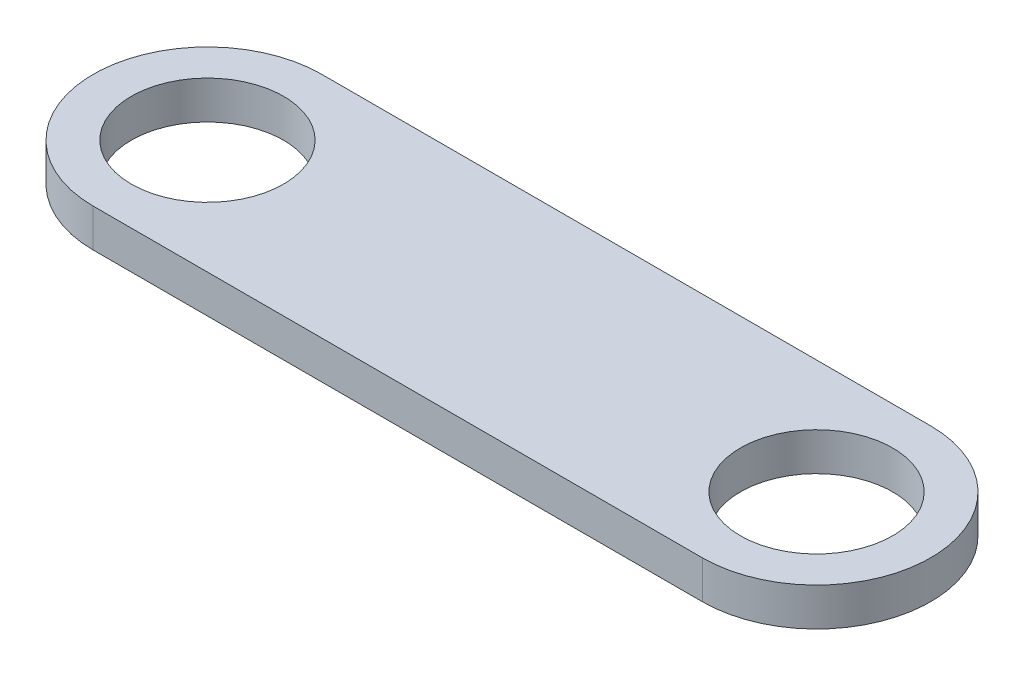
ISO-10303-21;
HEADER;
FILE_DESCRIPTION(('STEP AP214'),'2;1');
FILE_NAME('part.step','',(''),(''),'','','');
FILE_SCHEMA(('AUTOMOTIVE_DESIGN { 1 0 10303 214 1 1 1 1 }'));
ENDSEC;
DATA;
#1=APPLICATION_CONTEXT('core data for automotive mechanical design processes');
#2=APPLICATION_PROTOCOL_DEFINITION('international standard','automotive_design',2000,#1);
#3=PRODUCT_CONTEXT('',#1,'mechanical');
#4=PRODUCT('Part','Part','',(#3));
#5=PRODUCT_RELATED_PRODUCT_CATEGORY('part','',(#4));
#6=PRODUCT_DEFINITION_FORMATION('','',#4);
#7=PRODUCT_DEFINITION_CONTEXT('part definition',#1,'design');
#8=PRODUCT_DEFINITION('design','',#6,#7);
#9=PRODUCT_DEFINITION_SHAPE('','',#8);
#10=(LENGTH_UNIT() NAMED_UNIT(*) SI_UNIT(.MILLI.,.METRE.));
#11=(NAMED_UNIT(*) PLANE_ANGLE_UNIT() SI_UNIT($,.RADIAN.));
#12=(NAMED_UNIT(*) SI_UNIT($,.STERADIAN.) SOLID_ANGLE_UNIT());
#13=UNCERTAINTY_MEASURE_WITH_UNIT(LENGTH_MEASURE(1.E-05),#10,'distance_accuracy_value','');
#14=(GEOMETRIC_REPRESENTATION_CONTEXT(3) GLOBAL_UNCERTAINTY_ASSIGNED_CONTEXT((#13)) GLOBAL_UNIT_ASSIGNED_CONTEXT((#10,
#11,#12)) REPRESENTATION_CONTEXT('',''));
#15=CARTESIAN_POINT('',(0.,0.,0.));
#16=DIRECTION('',(0.,0.,1.));
#17=DIRECTION('',(1.,0.,0.));
#18=AXIS2_PLACEMENT_3D('',#15,#16,#17);
#19=CARTESIAN_POINT('',(0.,3.175,0.));
#20=DIRECTION('',(0.,1.,0.));
#21=DIRECTION('',(0.,0.,1.));
#22=AXIS2_PLACEMENT_3D('',#19,#20,#21);
#23=PLANE('',#22);
#24=CARTESIAN_POINT('',(0.,3.175,0.));
#25=DIRECTION('',(0.,1.,0.));
#26=DIRECTION('',(0.,0.,1.));
#27=AXIS2_PLACEMENT_3D('',#24,#25,#26);
#28=CIRCLE('',#27,6.35);
#29=CARTESIAN_POINT('',(0.,3.175,6.35));
#30=VERTEX_POINT('',#29);
#31=EDGE_CURVE('E100',#30,#30,#28,.T.);
#32=ORIENTED_EDGE('',*,*,#31,.F.);
#33=EDGE_LOOP('',(#32));
#34=FACE_BOUND('',#33,.T.);
#35=CARTESIAN_POINT('',(0.,3.175,0.));
#36=DIRECTION('',(0.,1.,0.));
#37=DIRECTION('',(0.,0.,1.));
#38=AXIS2_PLACEMENT_3D('',#35,#36,#37);
#39=CIRCLE('',#38,9.525);
#40=CARTESIAN_POINT('',(0.,3.175,-9.525));
#41=VERTEX_POINT('',#40);
#42=CARTESIAN_POINT('',(0.,3.175,9.525));
#43=VERTEX_POINT('',#42);
#44=EDGE_CURVE('E85',#41,#43,#39,.T.);
#45=ORIENTED_EDGE('',*,*,#44,.T.);
#46=DIRECTION('',(1.,0.,0.));
#47=VECTOR('',#46,1.);
#48=CARTESIAN_POINT('',(0.,3.175,9.525));
#49=LINE('',#48,#47);
#50=CARTESIAN_POINT('',(50.8,3.175,9.525));
#51=VERTEX_POINT('',#50);
#52=EDGE_CURVE('E80',#43,#51,#49,.T.);
#53=ORIENTED_EDGE('',*,*,#52,.T.);
#54=CARTESIAN_POINT('',(50.8,3.175,0.));
#55=DIRECTION('',(0.,1.,0.));
#56=DIRECTION('',(0.,0.,1.));
#57=AXIS2_PLACEMENT_3D('',#54,#55,#56);
#58=CIRCLE('',#57,9.525);
#59=CARTESIAN_POINT('',(50.8,3.175,-9.525));
#60=VERTEX_POINT('',#59);
#61=EDGE_CURVE('E83',#51,#60,#58,.T.);
#62=ORIENTED_EDGE('',*,*,#61,.T.);
#63=DIRECTION('',(-1.,0.,0.));
#64=VECTOR('',#63,1.);
#65=CARTESIAN_POINT('',(0.,3.175,-9.525));
#66=LINE('',#65,#64);
#67=EDGE_CURVE('E50',#60,#41,#66,.T.);
#68=ORIENTED_EDGE('',*,*,#67,.T.);
#69=EDGE_LOOP('',(#45,#53,#62,#68));
#70=FACE_BOUND('',#69,.T.);
#71=CARTESIAN_POINT('',(50.8,3.175,0.));
#72=DIRECTION('',(0.,1.,0.));
#73=DIRECTION('',(0.,0.,1.));
#74=AXIS2_PLACEMENT_3D('',#71,#72,#73);
#75=CIRCLE('',#74,6.35);
#76=CARTESIAN_POINT('',(50.8,3.175,6.35));
#77=VERTEX_POINT('',#76);
#78=EDGE_CURVE('E115',#77,#77,#75,.T.);
#79=ORIENTED_EDGE('',*,*,#78,.F.);
#80=EDGE_LOOP('',(#79));
#81=FACE_BOUND('',#80,.T.);
#82=ADVANCED_FACE('F33',(#34,#70,#81),#23,.T.);
#83=CARTESIAN_POINT('',(0.,0.,0.));
#84=DIRECTION('',(0.,1.,0.));
#85=DIRECTION('',(0.,0.,1.));
#86=AXIS2_PLACEMENT_3D('',#83,#84,#85);
#87=PLANE('',#86);
#88=CARTESIAN_POINT('',(0.,0.,0.));
#89=DIRECTION('',(0.,1.,0.));
#90=DIRECTION('',(0.,0.,1.));
#91=AXIS2_PLACEMENT_3D('',#88,#89,#90);
#92=CIRCLE('',#91,9.525);
#93=CARTESIAN_POINT('',(0.,0.,-9.525));
#94=VERTEX_POINT('',#93);
#95=CARTESIAN_POINT('',(0.,0.,9.525));
#96=VERTEX_POINT('',#95);
#97=EDGE_CURVE('E97',#94,#96,#92,.T.);
#98=ORIENTED_EDGE('',*,*,#97,.F.);
#99=DIRECTION('',(-1.,0.,0.));
#100=VECTOR('',#99,1.);
#101=CARTESIAN_POINT('',(0.,0.,-9.525));
#102=LINE('',#101,#100);
#103=CARTESIAN_POINT('',(50.8,0.,-9.525));
#104=VERTEX_POINT('',#103);
#105=EDGE_CURVE('E73',#104,#94,#102,.T.);
#106=ORIENTED_EDGE('',*,*,#105,.F.);
#107=CARTESIAN_POINT('',(50.8,0.,0.));
#108=DIRECTION('',(0.,1.,0.));
#109=DIRECTION('',(0.,0.,1.));
#110=AXIS2_PLACEMENT_3D('',#107,#108,#109);
#111=CIRCLE('',#110,9.525);
#112=CARTESIAN_POINT('',(50.8,0.,9.525));
#113=VERTEX_POINT('',#112);
#114=EDGE_CURVE('E67',#113,#104,#111,.T.);
#115=ORIENTED_EDGE('',*,*,#114,.F.);
#116=DIRECTION('',(1.,0.,0.));
#117=VECTOR('',#116,1.);
#118=CARTESIAN_POINT('',(0.,0.,9.525));
#119=LINE('',#118,#117);
#120=EDGE_CURVE('E89',#96,#113,#119,.T.);
#121=ORIENTED_EDGE('',*,*,#120,.F.);
#122=EDGE_LOOP('',(#98,#106,#115,#121));
#123=FACE_BOUND('',#122,.T.);
#124=CARTESIAN_POINT('',(0.,0.,0.));
#125=DIRECTION('',(0.,1.,0.));
#126=DIRECTION('',(0.,0.,1.));
#127=AXIS2_PLACEMENT_3D('',#124,#125,#126);
#128=CIRCLE('',#127,6.35);
#129=CARTESIAN_POINT('',(0.,0.,6.35));
#130=VERTEX_POINT('',#129);
#131=EDGE_CURVE('E112',#130,#130,#128,.T.);
#132=ORIENTED_EDGE('',*,*,#131,.T.);
#133=EDGE_LOOP('',(#132));
#134=FACE_BOUND('',#133,.T.);
#135=CARTESIAN_POINT('',(50.8,0.,0.));
#136=DIRECTION('',(0.,1.,0.));
#137=DIRECTION('',(0.,0.,1.));
#138=AXIS2_PLACEMENT_3D('',#135,#136,#137);
#139=CIRCLE('',#138,6.35);
#140=CARTESIAN_POINT('',(50.8,0.,6.35));
#141=VERTEX_POINT('',#140);
#142=EDGE_CURVE('E118',#141,#141,#139,.T.);
#143=ORIENTED_EDGE('',*,*,#142,.T.);
#144=EDGE_LOOP('',(#143));
#145=FACE_BOUND('',#144,.T.);
#146=ADVANCED_FACE('F108',(#123,#134,#145),#87,.F.);
#147=CARTESIAN_POINT('',(0.,3.175,0.));
#148=DIRECTION('',(0.,-1.,0.));
#149=DIRECTION('',(0.,0.,-1.));
#150=AXIS2_PLACEMENT_3D('',#147,#148,#149);
#151=CYLINDRICAL_SURFACE('',#150,9.525);
#152=ORIENTED_EDGE('',*,*,#97,.T.);
#153=DIRECTION('',(0.,-1.,0.));
#154=VECTOR('',#153,1.);
#155=CARTESIAN_POINT('',(0.,3.175,9.525));
#156=LINE('',#155,#154);
#157=EDGE_CURVE('E11',#43,#96,#156,.T.);
#158=ORIENTED_EDGE('',*,*,#157,.F.);
#159=ORIENTED_EDGE('',*,*,#44,.F.);
#160=DIRECTION('',(0.,-1.,0.));
#161=VECTOR('',#160,1.);
#162=CARTESIAN_POINT('',(0.,3.175,-9.525));
#163=LINE('',#162,#161);
#164=EDGE_CURVE('E93',#41,#94,#163,.T.);
#165=ORIENTED_EDGE('',*,*,#164,.T.);
#166=EDGE_LOOP('',(#152,#158,#159,#165));
#167=FACE_BOUND('',#166,.T.);
#168=ADVANCED_FACE('F35',(#167),#151,.T.);
#169=CARTESIAN_POINT('',(0.,3.175,9.525));
#170=DIRECTION('',(0.,0.,-1.));
#171=DIRECTION('',(-1.,0.,0.));
#172=AXIS2_PLACEMENT_3D('',#169,#170,#171);
#173=PLANE('',#172);
#174=ORIENTED_EDGE('',*,*,#120,.T.);
#175=DIRECTION('',(0.,-1.,0.));
#176=VECTOR('',#175,1.);
#177=CARTESIAN_POINT('',(50.8,3.175,9.525));
#178=LINE('',#177,#176);
#179=EDGE_CURVE('E42',#51,#113,#178,.T.);
#180=ORIENTED_EDGE('',*,*,#179,.F.);
#181=ORIENTED_EDGE('',*,*,#52,.F.);
#182=ORIENTED_EDGE('',*,*,#157,.T.);
#183=EDGE_LOOP('',(#174,#180,#181,#182));
#184=FACE_BOUND('',#183,.T.);
#185=ADVANCED_FACE('F88',(#184),#173,.F.);
#186=CARTESIAN_POINT('',(50.8,3.175,0.));
#187=DIRECTION('',(0.,-1.,0.));
#188=DIRECTION('',(0.,0.,-1.));
#189=AXIS2_PLACEMENT_3D('',#186,#187,#188);
#190=CYLINDRICAL_SURFACE('',#189,9.525);
#191=ORIENTED_EDGE('',*,*,#114,.T.);
#192=DIRECTION('',(0.,-1.,0.));
#193=VECTOR('',#192,1.);
#194=CARTESIAN_POINT('',(50.8,3.175,-9.525));
#195=LINE('',#194,#193);
#196=EDGE_CURVE('E90',#60,#104,#195,.T.);
#197=ORIENTED_EDGE('',*,*,#196,.F.);
#198=ORIENTED_EDGE('',*,*,#61,.F.);
#199=ORIENTED_EDGE('',*,*,#179,.T.);
#200=EDGE_LOOP('',(#191,#197,#198,#199));
#201=FACE_BOUND('',#200,.T.);
#202=ADVANCED_FACE('F91',(#201),#190,.T.);
#203=CARTESIAN_POINT('',(0.,3.175,-9.525));
#204=DIRECTION('',(0.,0.,1.));
#205=DIRECTION('',(1.,0.,0.));
#206=AXIS2_PLACEMENT_3D('',#203,#204,#205);
#207=PLANE('',#206);
#208=ORIENTED_EDGE('',*,*,#105,.T.);
#209=ORIENTED_EDGE('',*,*,#164,.F.);
#210=ORIENTED_EDGE('',*,*,#67,.F.);
#211=ORIENTED_EDGE('',*,*,#196,.T.);
#212=EDGE_LOOP('',(#208,#209,#210,#211));
#213=FACE_BOUND('',#212,.T.);
#214=ADVANCED_FACE('F105',(#213),#207,.F.);
#215=CARTESIAN_POINT('',(0.,3.175,0.));
#216=DIRECTION('',(0.,-1.,0.));
#217=DIRECTION('',(0.,0.,-1.));
#218=AXIS2_PLACEMENT_3D('',#215,#216,#217);
#219=CYLINDRICAL_SURFACE('',#218,6.35);
#220=ORIENTED_EDGE('',*,*,#31,.T.);
#221=EDGE_LOOP('',(#220));
#222=FACE_BOUND('',#221,.T.);
#223=ORIENTED_EDGE('',*,*,#131,.F.);
#224=EDGE_LOOP('',(#223));
#225=FACE_BOUND('',#224,.T.);
#226=ADVANCED_FACE('F135',(#222,#225),#219,.F.);
#227=CARTESIAN_POINT('',(50.8,3.175,0.));
#228=DIRECTION('',(0.,-1.,0.));
#229=DIRECTION('',(0.,0.,-1.));
#230=AXIS2_PLACEMENT_3D('',#227,#228,#229);
#231=CYLINDRICAL_SURFACE('',#230,6.35);
#232=ORIENTED_EDGE('',*,*,#78,.T.);
#233=EDGE_LOOP('',(#232));
#234=FACE_BOUND('',#233,.T.);
#235=ORIENTED_EDGE('',*,*,#142,.F.);
#236=EDGE_LOOP('',(#235));
#237=FACE_BOUND('',#236,.T.);
#238=ADVANCED_FACE('F124',(#234,#237),#231,.F.);
#239=CLOSED_SHELL('',(#82,#146,#168,#185,#202,#214,#226,#238));
#240=MANIFOLD_SOLID_BREP('B2',#239);
#241=ADVANCED_BREP_SHAPE_REPRESENTATION('',(#18,#240),#14);
#242=SHAPE_DEFINITION_REPRESENTATION(#9,#241);
ENDSEC;
END-ISO-10303-21;
